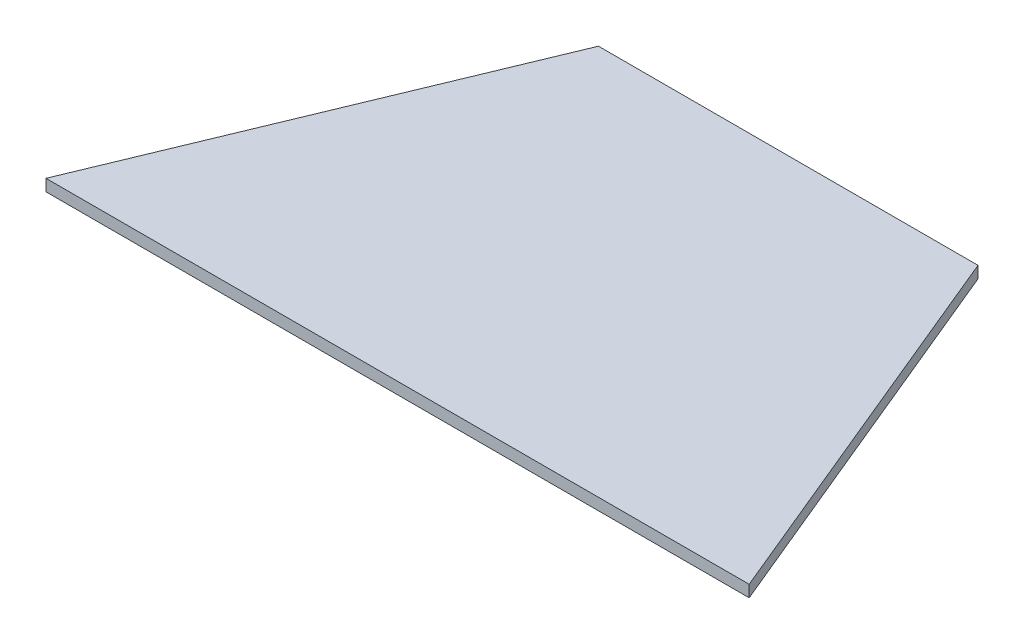
ISO-10303-21;
HEADER;
FILE_DESCRIPTION(('STEP AP214'),'2;1');
FILE_NAME('part.step','',(''),(''),'','','');
FILE_SCHEMA(('AUTOMOTIVE_DESIGN { 1 0 10303 214 1 1 1 1 }'));
ENDSEC;
DATA;
#1=APPLICATION_CONTEXT('core data for automotive mechanical design processes');
#2=APPLICATION_PROTOCOL_DEFINITION('international standard','automotive_design',2000,#1);
#3=PRODUCT_CONTEXT('',#1,'mechanical');
#4=PRODUCT('Part','Part','',(#3));
#5=PRODUCT_RELATED_PRODUCT_CATEGORY('part','',(#4));
#6=PRODUCT_DEFINITION_FORMATION('','',#4);
#7=PRODUCT_DEFINITION_CONTEXT('part definition',#1,'design');
#8=PRODUCT_DEFINITION('design','',#6,#7);
#9=PRODUCT_DEFINITION_SHAPE('','',#8);
#10=(LENGTH_UNIT() NAMED_UNIT(*) SI_UNIT(.MILLI.,.METRE.));
#11=(NAMED_UNIT(*) PLANE_ANGLE_UNIT() SI_UNIT($,.RADIAN.));
#12=(NAMED_UNIT(*) SI_UNIT($,.STERADIAN.) SOLID_ANGLE_UNIT());
#13=UNCERTAINTY_MEASURE_WITH_UNIT(LENGTH_MEASURE(1.E-05),#10,'distance_accuracy_value','');
#14=(GEOMETRIC_REPRESENTATION_CONTEXT(3) GLOBAL_UNCERTAINTY_ASSIGNED_CONTEXT((#13)) GLOBAL_UNIT_ASSIGNED_CONTEXT((#10,
#11,#12)) REPRESENTATION_CONTEXT('',''));
#15=CARTESIAN_POINT('',(0.,0.,0.));
#16=DIRECTION('',(0.,0.,1.));
#17=DIRECTION('',(1.,0.,0.));
#18=AXIS2_PLACEMENT_3D('',#15,#16,#17);
#19=CARTESIAN_POINT('',(0.,3.,0.));
#20=DIRECTION('',(0.923879532511288,0.,0.382683432365087));
#21=DIRECTION('',(0.382683432365087,0.,-0.923879532511288));
#22=AXIS2_PLACEMENT_3D('',#19,#20,#21);
#23=PLANE('',#22);
#24=DIRECTION('',(-0.382683432365087,0.,0.923879532511288));
#25=VECTOR('',#24,1.);
#26=CARTESIAN_POINT('',(0.,0.,0.));
#27=LINE('',#26,#25);
#28=CARTESIAN_POINT('',(41.4213562373092,0.,-100.));
#29=VERTEX_POINT('',#28);
#30=CARTESIAN_POINT('',(0.,0.,0.));
#31=VERTEX_POINT('',#30);
#32=EDGE_CURVE('E99',#29,#31,#27,.T.);
#33=ORIENTED_EDGE('',*,*,#32,.T.);
#34=DIRECTION('',(0.,-1.,0.));
#35=VECTOR('',#34,1.);
#36=CARTESIAN_POINT('',(0.,3.,0.));
#37=LINE('',#36,#35);
#38=CARTESIAN_POINT('',(0.,3.,0.));
#39=VERTEX_POINT('',#38);
#40=EDGE_CURVE('E11',#39,#31,#37,.T.);
#41=ORIENTED_EDGE('',*,*,#40,.F.);
#42=DIRECTION('',(-0.382683432365087,0.,0.923879532511288));
#43=VECTOR('',#42,1.);
#44=CARTESIAN_POINT('',(0.,3.,0.));
#45=LINE('',#44,#43);
#46=CARTESIAN_POINT('',(41.4213562373092,3.,-100.));
#47=VERTEX_POINT('',#46);
#48=EDGE_CURVE('E87',#47,#39,#45,.T.);
#49=ORIENTED_EDGE('',*,*,#48,.F.);
#50=DIRECTION('',(0.,-1.,0.));
#51=VECTOR('',#50,1.);
#52=CARTESIAN_POINT('',(41.4213562373092,3.,-100.));
#53=LINE('',#52,#51);
#54=EDGE_CURVE('E95',#47,#29,#53,.T.);
#55=ORIENTED_EDGE('',*,*,#54,.T.);
#56=EDGE_LOOP('',(#33,#41,#49,#55));
#57=FACE_BOUND('',#56,.T.);
#58=ADVANCED_FACE('F36',(#57),#23,.F.);
#59=CARTESIAN_POINT('',(0.,3.,0.));
#60=DIRECTION('',(0.,0.,-1.));
#61=DIRECTION('',(-1.,0.,0.));
#62=AXIS2_PLACEMENT_3D('',#59,#60,#61);
#63=PLANE('',#62);
#64=DIRECTION('',(1.,0.,0.));
#65=VECTOR('',#64,1.);
#66=CARTESIAN_POINT('',(0.,0.,0.));
#67=LINE('',#66,#65);
#68=CARTESIAN_POINT('',(180.,0.,0.));
#69=VERTEX_POINT('',#68);
#70=EDGE_CURVE('E91',#31,#69,#67,.T.);
#71=ORIENTED_EDGE('',*,*,#70,.T.);
#72=DIRECTION('',(0.,-1.,0.));
#73=VECTOR('',#72,1.);
#74=CARTESIAN_POINT('',(180.,3.,0.));
#75=LINE('',#74,#73);
#76=CARTESIAN_POINT('',(180.,3.,0.));
#77=VERTEX_POINT('',#76);
#78=EDGE_CURVE('E44',#77,#69,#75,.T.);
#79=ORIENTED_EDGE('',*,*,#78,.F.);
#80=DIRECTION('',(1.,0.,0.));
#81=VECTOR('',#80,1.);
#82=CARTESIAN_POINT('',(0.,3.,0.));
#83=LINE('',#82,#81);
#84=EDGE_CURVE('E82',#39,#77,#83,.T.);
#85=ORIENTED_EDGE('',*,*,#84,.F.);
#86=ORIENTED_EDGE('',*,*,#40,.T.);
#87=EDGE_LOOP('',(#71,#79,#85,#86));
#88=FACE_BOUND('',#87,.T.);
#89=ADVANCED_FACE('F90',(#88),#63,.F.);
#90=CARTESIAN_POINT('',(180.,3.,0.));
#91=DIRECTION('',(-0.923879532511285,0.,0.382683432365094));
#92=DIRECTION('',(0.382683432365094,0.,0.923879532511285));
#93=AXIS2_PLACEMENT_3D('',#90,#91,#92);
#94=PLANE('',#93);
#95=DIRECTION('',(-0.382683432365094,0.,-0.923879532511285));
#96=VECTOR('',#95,1.);
#97=CARTESIAN_POINT('',(180.,0.,0.));
#98=LINE('',#97,#96);
#99=CARTESIAN_POINT('',(138.57864376269,0.,-100.));
#100=VERTEX_POINT('',#99);
#101=EDGE_CURVE('E69',#69,#100,#98,.T.);
#102=ORIENTED_EDGE('',*,*,#101,.T.);
#103=DIRECTION('',(0.,-1.,0.));
#104=VECTOR('',#103,1.);
#105=CARTESIAN_POINT('',(138.57864376269,3.,-100.));
#106=LINE('',#105,#104);
#107=CARTESIAN_POINT('',(138.57864376269,3.,-100.));
#108=VERTEX_POINT('',#107);
#109=EDGE_CURVE('E92',#108,#100,#106,.T.);
#110=ORIENTED_EDGE('',*,*,#109,.F.);
#111=DIRECTION('',(-0.382683432365094,0.,-0.923879532511285));
#112=VECTOR('',#111,1.);
#113=CARTESIAN_POINT('',(180.,3.,0.));
#114=LINE('',#113,#112);
#115=EDGE_CURVE('E85',#77,#108,#114,.T.);
#116=ORIENTED_EDGE('',*,*,#115,.F.);
#117=ORIENTED_EDGE('',*,*,#78,.T.);
#118=EDGE_LOOP('',(#102,#110,#116,#117));
#119=FACE_BOUND('',#118,.T.);
#120=ADVANCED_FACE('F93',(#119),#94,.F.);
#121=CARTESIAN_POINT('',(41.4213562373092,3.,-100.));
#122=DIRECTION('',(0.,0.,1.));
#123=DIRECTION('',(1.,0.,0.));
#124=AXIS2_PLACEMENT_3D('',#121,#122,#123);
#125=PLANE('',#124);
#126=DIRECTION('',(-1.,0.,0.));
#127=VECTOR('',#126,1.);
#128=CARTESIAN_POINT('',(41.4213562373092,0.,-100.));
#129=LINE('',#128,#127);
#130=EDGE_CURVE('E75',#100,#29,#129,.T.);
#131=ORIENTED_EDGE('',*,*,#130,.T.);
#132=ORIENTED_EDGE('',*,*,#54,.F.);
#133=DIRECTION('',(-1.,0.,0.));
#134=VECTOR('',#133,1.);
#135=CARTESIAN_POINT('',(41.4213562373092,3.,-100.));
#136=LINE('',#135,#134);
#137=EDGE_CURVE('E52',#108,#47,#136,.T.);
#138=ORIENTED_EDGE('',*,*,#137,.F.);
#139=ORIENTED_EDGE('',*,*,#109,.T.);
#140=EDGE_LOOP('',(#131,#132,#138,#139));
#141=FACE_BOUND('',#140,.T.);
#142=ADVANCED_FACE('F106',(#141),#125,.F.);
#143=CARTESIAN_POINT('',(0.,3.,0.));
#144=DIRECTION('',(0.,-1.,0.));
#145=DIRECTION('',(0.,0.,-1.));
#146=AXIS2_PLACEMENT_3D('',#143,#144,#145);
#147=PLANE('',#146);
#148=ORIENTED_EDGE('',*,*,#48,.T.);
#149=ORIENTED_EDGE('',*,*,#84,.T.);
#150=ORIENTED_EDGE('',*,*,#115,.T.);
#151=ORIENTED_EDGE('',*,*,#137,.T.);
#152=EDGE_LOOP('',(#148,#149,#150,#151));
#153=FACE_BOUND('',#152,.T.);
#154=ADVANCED_FACE('F83',(#153),#147,.F.);
#155=CARTESIAN_POINT('',(0.,0.,0.));
#156=DIRECTION('',(0.,-1.,0.));
#157=DIRECTION('',(0.,0.,-1.));
#158=AXIS2_PLACEMENT_3D('',#155,#156,#157);
#159=PLANE('',#158);
#160=ORIENTED_EDGE('',*,*,#32,.F.);
#161=ORIENTED_EDGE('',*,*,#130,.F.);
#162=ORIENTED_EDGE('',*,*,#101,.F.);
#163=ORIENTED_EDGE('',*,*,#70,.F.);
#164=EDGE_LOOP('',(#160,#161,#162,#163));
#165=FACE_BOUND('',#164,.T.);
#166=ADVANCED_FACE('F109',(#165),#159,.T.);
#167=CLOSED_SHELL('',(#58,#89,#120,#142,#154,#166));
#168=MANIFOLD_SOLID_BREP('B2',#167);
#169=ADVANCED_BREP_SHAPE_REPRESENTATION('',(#18,#168),#14);
#170=SHAPE_DEFINITION_REPRESENTATION(#9,#169);
ENDSEC;
END-ISO-10303-21;
